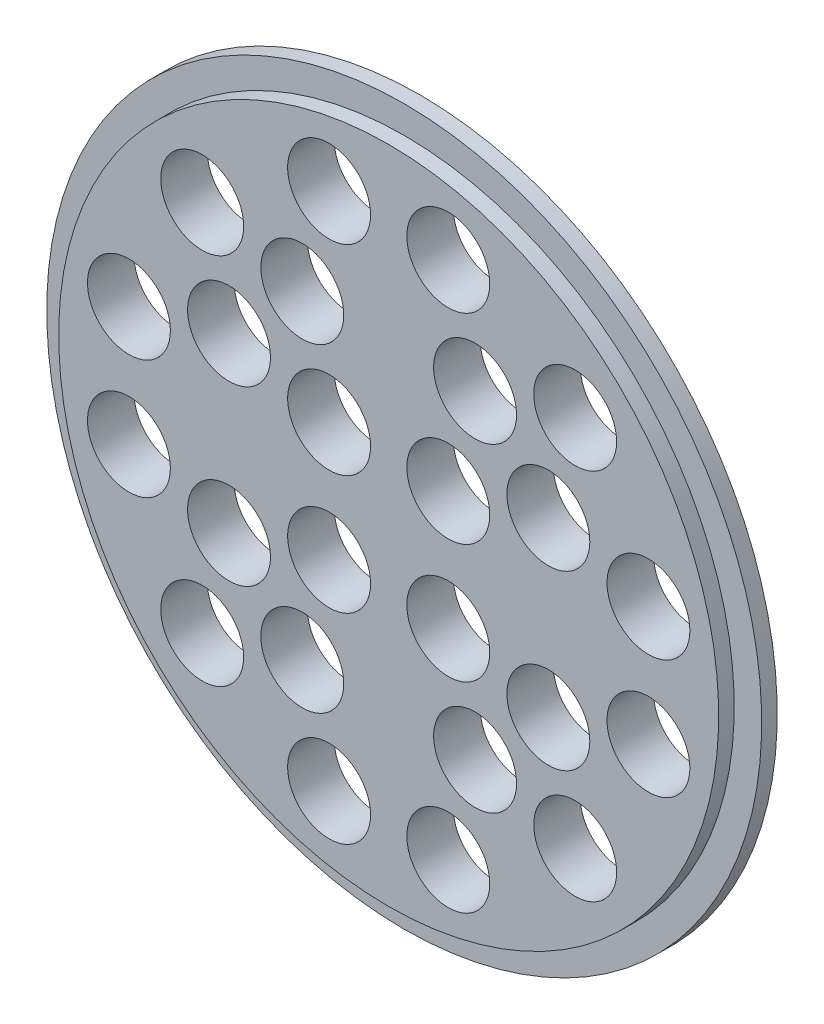
ISO-10303-21;
HEADER;
FILE_DESCRIPTION(('STEP AP214'),'2;1');
FILE_NAME('part.step','',(''),(''),'','','');
FILE_SCHEMA(('AUTOMOTIVE_DESIGN { 1 0 10303 214 1 1 1 1 }'));
ENDSEC;
DATA;
#1=APPLICATION_CONTEXT('core data for automotive mechanical design processes');
#2=APPLICATION_PROTOCOL_DEFINITION('international standard','automotive_design',2000,#1);
#3=PRODUCT_CONTEXT('',#1,'mechanical');
#4=PRODUCT('Part','Part','',(#3));
#5=PRODUCT_RELATED_PRODUCT_CATEGORY('part','',(#4));
#6=PRODUCT_DEFINITION_FORMATION('','',#4);
#7=PRODUCT_DEFINITION_CONTEXT('part definition',#1,'design');
#8=PRODUCT_DEFINITION('design','',#6,#7);
#9=PRODUCT_DEFINITION_SHAPE('','',#8);
#10=(LENGTH_UNIT() NAMED_UNIT(*) SI_UNIT(.MILLI.,.METRE.));
#11=(NAMED_UNIT(*) PLANE_ANGLE_UNIT() SI_UNIT($,.RADIAN.));
#12=(NAMED_UNIT(*) SI_UNIT($,.STERADIAN.) SOLID_ANGLE_UNIT());
#13=UNCERTAINTY_MEASURE_WITH_UNIT(LENGTH_MEASURE(1.E-05),#10,'distance_accuracy_value','');
#14=(GEOMETRIC_REPRESENTATION_CONTEXT(3) GLOBAL_UNCERTAINTY_ASSIGNED_CONTEXT((#13)) GLOBAL_UNIT_ASSIGNED_CONTEXT((#10,
#11,#12)) REPRESENTATION_CONTEXT('',''));
#15=CARTESIAN_POINT('',(0.,0.,0.));
#16=DIRECTION('',(0.,0.,1.));
#17=DIRECTION('',(1.,0.,0.));
#18=AXIS2_PLACEMENT_3D('',#15,#16,#17);
#19=CARTESIAN_POINT('',(0.,0.,0.));
#20=DIRECTION('',(0.,0.,1.));
#21=DIRECTION('',(1.,0.,0.));
#22=AXIS2_PLACEMENT_3D('',#19,#20,#21);
#23=PLANE('',#22);
#24=CARTESIAN_POINT('',(-25.0684769508544,5.74996042511669,0.));
#25=DIRECTION('',(0.,0.,1.));
#26=DIRECTION('',(1.,0.,0.));
#27=AXIS2_PLACEMENT_3D('',#24,#25,#26);
#28=CIRCLE('',#27,3.99999999999999);
#29=CARTESIAN_POINT('',(-21.0684769508544,5.74996042511669,0.));
#30=VERTEX_POINT('',#29);
#31=EDGE_CURVE('E104',#30,#30,#28,.T.);
#32=ORIENTED_EDGE('',*,*,#31,.T.);
#33=EDGE_LOOP('',(#32));
#34=FACE_BOUND('',#33,.T.);
#35=CARTESIAN_POINT('',(-5.74996042504571,25.0684769508707,0.));
#36=DIRECTION('',(0.,0.,1.));
#37=DIRECTION('',(1.,0.,0.));
#38=AXIS2_PLACEMENT_3D('',#35,#36,#37);
#39=CIRCLE('',#38,4.00000000000001);
#40=CARTESIAN_POINT('',(-1.7499604250457,25.0684769508707,0.));
#41=VERTEX_POINT('',#40);
#42=EDGE_CURVE('E118',#41,#41,#39,.T.);
#43=ORIENTED_EDGE('',*,*,#42,.T.);
#44=EDGE_LOOP('',(#43));
#45=FACE_BOUND('',#44,.T.);
#46=CARTESIAN_POINT('',(-8.33815087608457,15.4092186879837,0.));
#47=DIRECTION('',(0.,0.,1.));
#48=DIRECTION('',(1.,0.,0.));
#49=AXIS2_PLACEMENT_3D('',#46,#47,#48);
#50=CIRCLE('',#49,4.);
#51=CARTESIAN_POINT('',(-4.33815087608457,15.4092186879837,0.));
#52=VERTEX_POINT('',#51);
#53=EDGE_CURVE('E124',#52,#52,#50,.T.);
#54=ORIENTED_EDGE('',*,*,#53,.T.);
#55=EDGE_LOOP('',(#54));
#56=FACE_BOUND('',#55,.T.);
#57=CARTESIAN_POINT('',(-17.9974091389716,17.9974091390226,0.));
#58=DIRECTION('',(0.,0.,1.));
#59=DIRECTION('',(1.,0.,0.));
#60=AXIS2_PLACEMENT_3D('',#57,#58,#59);
#61=CIRCLE('',#60,4.);
#62=CARTESIAN_POINT('',(-13.9974091389716,17.9974091390226,0.));
#63=VERTEX_POINT('',#62);
#64=EDGE_CURVE('E130',#63,#63,#61,.T.);
#65=ORIENTED_EDGE('',*,*,#64,.T.);
#66=EDGE_LOOP('',(#65));
#67=FACE_BOUND('',#66,.T.);
#68=CARTESIAN_POINT('',(-15.4092186879601,8.33815087612825,0.));
#69=DIRECTION('',(0.,0.,1.));
#70=DIRECTION('',(1.,0.,0.));
#71=AXIS2_PLACEMENT_3D('',#68,#69,#70);
#72=CIRCLE('',#71,4.);
#73=CARTESIAN_POINT('',(-11.4092186879601,8.33815087612825,0.));
#74=VERTEX_POINT('',#73);
#75=EDGE_CURVE('E136',#74,#74,#72,.T.);
#76=ORIENTED_EDGE('',*,*,#75,.T.);
#77=EDGE_LOOP('',(#76));
#78=FACE_BOUND('',#77,.T.);
#79=CARTESIAN_POINT('',(-5.74996042507306,5.74996042508934,0.));
#80=DIRECTION('',(0.,0.,1.));
#81=DIRECTION('',(1.,0.,0.));
#82=AXIS2_PLACEMENT_3D('',#79,#80,#81);
#83=CIRCLE('',#82,4.);
#84=CARTESIAN_POINT('',(-1.74996042507306,5.74996042508934,0.));
#85=VERTEX_POINT('',#84);
#86=EDGE_CURVE('E142',#85,#85,#83,.T.);
#87=ORIENTED_EDGE('',*,*,#86,.T.);
#88=EDGE_LOOP('',(#87));
#89=FACE_BOUND('',#88,.T.);
#90=CARTESIAN_POINT('',(-5.74992085018606,-25.0685165257759,0.));
#91=DIRECTION('',(0.,0.,1.));
#92=DIRECTION('',(1.,0.,0.));
#93=AXIS2_PLACEMENT_3D('',#90,#91,#92);
#94=CIRCLE('',#93,4.00000000000001);
#95=CARTESIAN_POINT('',(-1.74992085018605,-25.0685165257759,0.));
#96=VERTEX_POINT('',#95);
#97=EDGE_CURVE('E148',#96,#96,#94,.T.);
#98=ORIENTED_EDGE('',*,*,#97,.T.);
#99=EDGE_LOOP('',(#98));
#100=FACE_BOUND('',#99,.T.);
#101=CARTESIAN_POINT('',(-25.0684373759492,-5.74999999997634,0.));
#102=DIRECTION('',(0.,0.,1.));
#103=DIRECTION('',(1.,0.,0.));
#104=AXIS2_PLACEMENT_3D('',#101,#102,#103);
#105=CIRCLE('',#104,3.99999999999999);
#106=CARTESIAN_POINT('',(-21.0684373759492,-5.74999999997634,0.));
#107=VERTEX_POINT('',#106);
#108=EDGE_CURVE('E154',#107,#107,#105,.T.);
#109=ORIENTED_EDGE('',*,*,#108,.T.);
#110=EDGE_LOOP('',(#109));
#111=FACE_BOUND('',#110,.T.);
#112=CARTESIAN_POINT('',(-15.409179113061,-8.33819045101064,0.));
#113=DIRECTION('',(0.,0.,1.));
#114=DIRECTION('',(1.,0.,0.));
#115=AXIS2_PLACEMENT_3D('',#112,#113,#114);
#116=CIRCLE('',#115,3.99999999999999);
#117=CARTESIAN_POINT('',(-11.409179113061,-8.33819045101064,0.));
#118=VERTEX_POINT('',#117);
#119=EDGE_CURVE('E160',#118,#118,#116,.T.);
#120=ORIENTED_EDGE('',*,*,#119,.T.);
#121=EDGE_LOOP('',(#120));
#122=FACE_BOUND('',#121,.T.);
#123=CARTESIAN_POINT('',(-17.9973695640953,-17.9974487138989,0.));
#124=DIRECTION('',(0.,0.,1.));
#125=DIRECTION('',(1.,0.,0.));
#126=AXIS2_PLACEMENT_3D('',#123,#124,#125);
#127=CIRCLE('',#126,4.);
#128=CARTESIAN_POINT('',(-13.9973695640953,-17.9974487138989,0.));
#129=VERTEX_POINT('',#128);
#130=EDGE_CURVE('E166',#129,#129,#127,.T.);
#131=ORIENTED_EDGE('',*,*,#130,.T.);
#132=EDGE_LOOP('',(#131));
#133=FACE_BOUND('',#132,.T.);
#134=CARTESIAN_POINT('',(-8.33811130120218,-15.4092582628828,0.));
#135=DIRECTION('',(0.,0.,1.));
#136=DIRECTION('',(1.,0.,0.));
#137=AXIS2_PLACEMENT_3D('',#134,#135,#136);
#138=CIRCLE('',#137,4.);
#139=CARTESIAN_POINT('',(-4.33811130120218,-15.4092582628828,0.));
#140=VERTEX_POINT('',#139);
#141=EDGE_CURVE('E172',#140,#140,#138,.T.);
#142=ORIENTED_EDGE('',*,*,#141,.T.);
#143=EDGE_LOOP('',(#142));
#144=FACE_BOUND('',#143,.T.);
#145=CARTESIAN_POINT('',(-5.74992085016783,-5.74999999999457,0.));
#146=DIRECTION('',(0.,0.,1.));
#147=DIRECTION('',(1.,0.,0.));
#148=AXIS2_PLACEMENT_3D('',#145,#146,#147);
#149=CIRCLE('',#148,4.);
#150=CARTESIAN_POINT('',(-1.74992085016782,-5.74999999999457,0.));
#151=VERTEX_POINT('',#150);
#152=EDGE_CURVE('E178',#151,#151,#149,.T.);
#153=ORIENTED_EDGE('',*,*,#152,.T.);
#154=EDGE_LOOP('',(#153));
#155=FACE_BOUND('',#154,.T.);
#156=CARTESIAN_POINT('',(0.,0.,0.));
#157=DIRECTION('',(0.,0.,-1.));
#158=DIRECTION('',(0.,1.,0.));
#159=AXIS2_PLACEMENT_3D('',#156,#157,#158);
#160=CIRCLE('',#159,31.85);
#161=CARTESIAN_POINT('',(-0.774999999999998,-31.8405696400049,0.));
#162=VERTEX_POINT('',#161);
#163=CARTESIAN_POINT('',(-0.774999999999998,31.8405696400049,0.));
#164=VERTEX_POINT('',#163);
#165=EDGE_CURVE('E94',#162,#164,#160,.T.);
#166=ORIENTED_EDGE('',*,*,#165,.T.);
#167=DIRECTION('',(0.,1.,0.));
#168=VECTOR('',#167,1.);
#169=CARTESIAN_POINT('',(-0.774999999999998,-34.5,0.));
#170=LINE('',#169,#168);
#171=EDGE_CURVE('E58',#162,#164,#170,.T.);
#172=ORIENTED_EDGE('',*,*,#171,.F.);
#173=EDGE_LOOP('',(#166,#172));
#174=FACE_BOUND('',#173,.T.);
#175=ADVANCED_FACE('F36',(#34,#45,#56,#67,#78,#89,#100,#111,#122,#133,#144,#155,#174),#23,.F.);
#176=CARTESIAN_POINT('',(0.,0.,0.));
#177=DIRECTION('',(0.,0.,-1.));
#178=DIRECTION('',(0.,1.,0.));
#179=AXIS2_PLACEMENT_3D('',#176,#177,#178);
#180=CYLINDRICAL_SURFACE('',#179,31.85);
#181=CARTESIAN_POINT('',(0.,0.,1.49999999999999));
#182=DIRECTION('',(0.,0.,-1.));
#183=DIRECTION('',(0.,1.,0.));
#184=AXIS2_PLACEMENT_3D('',#181,#182,#183);
#185=CIRCLE('',#184,31.85);
#186=CARTESIAN_POINT('',(-0.775,-31.8405696400049,1.49999999999999));
#187=VERTEX_POINT('',#186);
#188=CARTESIAN_POINT('',(-0.775,31.8405696400049,1.49999999999999));
#189=VERTEX_POINT('',#188);
#190=EDGE_CURVE('E95',#187,#189,#185,.T.);
#191=ORIENTED_EDGE('',*,*,#190,.T.);
#192=DIRECTION('',(0.,0.,-1.));
#193=VECTOR('',#192,1.);
#194=CARTESIAN_POINT('',(-0.774999999999998,31.8405696400049,0.));
#195=LINE('',#194,#193);
#196=EDGE_CURVE('E109',#189,#164,#195,.T.);
#197=ORIENTED_EDGE('',*,*,#196,.T.);
#198=ORIENTED_EDGE('',*,*,#165,.F.);
#199=DIRECTION('',(0.,0.,-1.));
#200=VECTOR('',#199,1.);
#201=CARTESIAN_POINT('',(-0.774999999999998,-31.8405696400049,0.));
#202=LINE('',#201,#200);
#203=EDGE_CURVE('E298',#162,#187,#202,.F.);
#204=ORIENTED_EDGE('',*,*,#203,.T.);
#205=EDGE_LOOP('',(#191,#197,#198,#204));
#206=FACE_BOUND('',#205,.T.);
#207=ADVANCED_FACE('F272',(#206),#180,.T.);
#208=CARTESIAN_POINT('',(0.,0.,4.5));
#209=DIRECTION('',(0.,0.,1.));
#210=DIRECTION('',(1.,0.,0.));
#211=AXIS2_PLACEMENT_3D('',#208,#209,#210);
#212=PLANE('',#211);
#213=CARTESIAN_POINT('',(0.,0.,4.49999999999999));
#214=DIRECTION('',(0.,0.,-1.));
#215=DIRECTION('',(0.,1.,0.));
#216=AXIS2_PLACEMENT_3D('',#213,#214,#215);
#217=CIRCLE('',#216,31.85);
#218=CARTESIAN_POINT('',(0.,31.85,4.5));
#219=VERTEX_POINT('',#218);
#220=EDGE_CURVE('E112',#219,#219,#217,.T.);
#221=ORIENTED_EDGE('',*,*,#220,.F.);
#222=EDGE_LOOP('',(#221));
#223=FACE_BOUND('',#222,.T.);
#224=CARTESIAN_POINT('',(-5.74996042504571,25.0684769508707,4.5));
#225=DIRECTION('',(0.,0.,1.));
#226=DIRECTION('',(1.,0.,0.));
#227=AXIS2_PLACEMENT_3D('',#224,#225,#226);
#228=CIRCLE('',#227,4.00000000000001);
#229=CARTESIAN_POINT('',(-1.7499604250457,25.0684769508707,4.5));
#230=VERTEX_POINT('',#229);
#231=EDGE_CURVE('E121',#230,#230,#228,.T.);
#232=ORIENTED_EDGE('',*,*,#231,.F.);
#233=EDGE_LOOP('',(#232));
#234=FACE_BOUND('',#233,.T.);
#235=CARTESIAN_POINT('',(-17.9974091389716,17.9974091390226,4.5));
#236=DIRECTION('',(0.,0.,1.));
#237=DIRECTION('',(1.,0.,0.));
#238=AXIS2_PLACEMENT_3D('',#235,#236,#237);
#239=CIRCLE('',#238,4.);
#240=CARTESIAN_POINT('',(-13.9974091389716,17.9974091390226,4.5));
#241=VERTEX_POINT('',#240);
#242=EDGE_CURVE('E133',#241,#241,#239,.T.);
#243=ORIENTED_EDGE('',*,*,#242,.F.);
#244=EDGE_LOOP('',(#243));
#245=FACE_BOUND('',#244,.T.);
#246=CARTESIAN_POINT('',(-5.74996042507306,5.74996042508934,4.5));
#247=DIRECTION('',(0.,0.,1.));
#248=DIRECTION('',(1.,0.,0.));
#249=AXIS2_PLACEMENT_3D('',#246,#247,#248);
#250=CIRCLE('',#249,4.);
#251=CARTESIAN_POINT('',(-1.74996042507306,5.74996042508934,4.5));
#252=VERTEX_POINT('',#251);
#253=EDGE_CURVE('E145',#252,#252,#250,.T.);
#254=ORIENTED_EDGE('',*,*,#253,.F.);
#255=EDGE_LOOP('',(#254));
#256=FACE_BOUND('',#255,.T.);
#257=CARTESIAN_POINT('',(-25.0684373759492,-5.74999999997634,4.5));
#258=DIRECTION('',(0.,0.,1.));
#259=DIRECTION('',(1.,0.,0.));
#260=AXIS2_PLACEMENT_3D('',#257,#258,#259);
#261=CIRCLE('',#260,3.99999999999999);
#262=CARTESIAN_POINT('',(-21.0684373759492,-5.74999999997634,4.5));
#263=VERTEX_POINT('',#262);
#264=EDGE_CURVE('E157',#263,#263,#261,.T.);
#265=ORIENTED_EDGE('',*,*,#264,.F.);
#266=EDGE_LOOP('',(#265));
#267=FACE_BOUND('',#266,.T.);
#268=CARTESIAN_POINT('',(-17.9973695640953,-17.9974487138989,4.5));
#269=DIRECTION('',(0.,0.,1.));
#270=DIRECTION('',(1.,0.,0.));
#271=AXIS2_PLACEMENT_3D('',#268,#269,#270);
#272=CIRCLE('',#271,4.);
#273=CARTESIAN_POINT('',(-13.9973695640953,-17.9974487138989,4.5));
#274=VERTEX_POINT('',#273);
#275=EDGE_CURVE('E169',#274,#274,#272,.T.);
#276=ORIENTED_EDGE('',*,*,#275,.F.);
#277=EDGE_LOOP('',(#276));
#278=FACE_BOUND('',#277,.T.);
#279=CARTESIAN_POINT('',(-5.74992085016783,-5.74999999999457,4.5));
#280=DIRECTION('',(0.,0.,1.));
#281=DIRECTION('',(1.,0.,0.));
#282=AXIS2_PLACEMENT_3D('',#279,#280,#281);
#283=CIRCLE('',#282,4.);
#284=CARTESIAN_POINT('',(-1.74992085016782,-5.74999999999457,4.5));
#285=VERTEX_POINT('',#284);
#286=EDGE_CURVE('E181',#285,#285,#283,.T.);
#287=ORIENTED_EDGE('',*,*,#286,.F.);
#288=EDGE_LOOP('',(#287));
#289=FACE_BOUND('',#288,.T.);
#290=CARTESIAN_POINT('',(5.75003957490697,-25.0684769508653,4.5));
#291=DIRECTION('',(0.,0.,1.));
#292=DIRECTION('',(1.,0.,0.));
#293=AXIS2_PLACEMENT_3D('',#290,#291,#292);
#294=CIRCLE('',#293,4.00000000000001);
#295=CARTESIAN_POINT('',(9.75003957490698,-25.0684769508653,4.5));
#296=VERTEX_POINT('',#295);
#297=EDGE_CURVE('E193',#296,#296,#294,.T.);
#298=ORIENTED_EDGE('',*,*,#297,.F.);
#299=EDGE_LOOP('',(#298));
#300=FACE_BOUND('',#299,.T.);
#301=CARTESIAN_POINT('',(17.9974882888262,-17.9974091390056,4.5));
#302=DIRECTION('',(0.,0.,1.));
#303=DIRECTION('',(1.,0.,0.));
#304=AXIS2_PLACEMENT_3D('',#301,#302,#303);
#305=CIRCLE('',#304,3.99999999999999);
#306=CARTESIAN_POINT('',(21.9974882888262,-17.9974091390056,4.5));
#307=VERTEX_POINT('',#306);
#308=EDGE_CURVE('E205',#307,#307,#305,.T.);
#309=ORIENTED_EDGE('',*,*,#308,.F.);
#310=EDGE_LOOP('',(#309));
#311=FACE_BOUND('',#310,.T.);
#312=CARTESIAN_POINT('',(5.75003957491609,-5.74996042508391,4.5));
#313=DIRECTION('',(0.,0.,1.));
#314=DIRECTION('',(1.,0.,0.));
#315=AXIS2_PLACEMENT_3D('',#312,#313,#314);
#316=CIRCLE('',#315,4.);
#317=CARTESIAN_POINT('',(9.75003957491608,-5.74996042508391,4.5));
#318=VERTEX_POINT('',#317);
#319=EDGE_CURVE('E217',#318,#318,#316,.T.);
#320=ORIENTED_EDGE('',*,*,#319,.F.);
#321=EDGE_LOOP('',(#320));
#322=FACE_BOUND('',#321,.T.);
#323=CARTESIAN_POINT('',(25.0685165257814,5.75,4.5));
#324=DIRECTION('',(0.,0.,1.));
#325=DIRECTION('',(1.,0.,0.));
#326=AXIS2_PLACEMENT_3D('',#323,#324,#325);
#327=CIRCLE('',#326,4.00000000000003);
#328=CARTESIAN_POINT('',(29.0685165257814,5.75,4.5));
#329=VERTEX_POINT('',#328);
#330=EDGE_CURVE('E229',#329,#329,#327,.T.);
#331=ORIENTED_EDGE('',*,*,#330,.F.);
#332=EDGE_LOOP('',(#331));
#333=FACE_BOUND('',#332,.T.);
#334=CARTESIAN_POINT('',(17.9974487139159,17.9974487139159,4.5));
#335=DIRECTION('',(0.,0.,1.));
#336=DIRECTION('',(1.,0.,0.));
#337=AXIS2_PLACEMENT_3D('',#334,#335,#336);
#338=CIRCLE('',#337,3.99999999999999);
#339=CARTESIAN_POINT('',(21.9974487139159,17.9974487139159,4.5));
#340=VERTEX_POINT('',#339);
#341=EDGE_CURVE('E241',#340,#340,#338,.T.);
#342=ORIENTED_EDGE('',*,*,#341,.F.);
#343=EDGE_LOOP('',(#342));
#344=FACE_BOUND('',#343,.T.);
#345=CARTESIAN_POINT('',(5.75,5.75,4.5));
#346=DIRECTION('',(0.,0.,1.));
#347=DIRECTION('',(1.,0.,0.));
#348=AXIS2_PLACEMENT_3D('',#345,#346,#347);
#349=CIRCLE('',#348,4.);
#350=CARTESIAN_POINT('',(9.75,5.75,4.5));
#351=VERTEX_POINT('',#350);
#352=EDGE_CURVE('E11',#351,#351,#349,.T.);
#353=ORIENTED_EDGE('',*,*,#352,.F.);
#354=EDGE_LOOP('',(#353));
#355=FACE_BOUND('',#354,.T.);
#356=CARTESIAN_POINT('',(8.33819045102524,15.4092582628907,4.5));
#357=DIRECTION('',(0.,0.,1.));
#358=DIRECTION('',(1.,0.,0.));
#359=AXIS2_PLACEMENT_3D('',#356,#357,#358);
#360=CIRCLE('',#359,4.00000000000001);
#361=CARTESIAN_POINT('',(12.3381904510253,15.4092582628907,4.5));
#362=VERTEX_POINT('',#361);
#363=EDGE_CURVE('E247',#362,#362,#360,.T.);
#364=ORIENTED_EDGE('',*,*,#363,.F.);
#365=EDGE_LOOP('',(#364));
#366=FACE_BOUND('',#365,.T.);
#367=CARTESIAN_POINT('',(15.4092582628907,8.33819045102518,4.5));
#368=DIRECTION('',(0.,0.,1.));
#369=DIRECTION('',(1.,0.,0.));
#370=AXIS2_PLACEMENT_3D('',#367,#368,#369);
#371=CIRCLE('',#370,3.99999999999999);
#372=CARTESIAN_POINT('',(19.4092582628907,8.33819045102518,4.5));
#373=VERTEX_POINT('',#372);
#374=EDGE_CURVE('E235',#373,#373,#371,.T.);
#375=ORIENTED_EDGE('',*,*,#374,.F.);
#376=EDGE_LOOP('',(#375));
#377=FACE_BOUND('',#376,.T.);
#378=CARTESIAN_POINT('',(5.75,25.0685165257814,4.5));
#379=DIRECTION('',(0.,0.,1.));
#380=DIRECTION('',(1.,0.,0.));
#381=AXIS2_PLACEMENT_3D('',#378,#379,#380);
#382=CIRCLE('',#381,4.00000000000001);
#383=CARTESIAN_POINT('',(9.75000000000001,25.0685165257814,4.5));
#384=VERTEX_POINT('',#383);
#385=EDGE_CURVE('E223',#384,#384,#382,.T.);
#386=ORIENTED_EDGE('',*,*,#385,.F.);
#387=EDGE_LOOP('',(#386));
#388=FACE_BOUND('',#387,.T.);
#389=CARTESIAN_POINT('',(15.4092978378055,-8.3381508761137,4.5));
#390=DIRECTION('',(0.,0.,1.));
#391=DIRECTION('',(1.,0.,0.));
#392=AXIS2_PLACEMENT_3D('',#389,#390,#391);
#393=CIRCLE('',#392,3.99999999999999);
#394=CARTESIAN_POINT('',(19.4092978378055,-8.3381508761137,4.5));
#395=VERTEX_POINT('',#394);
#396=EDGE_CURVE('E211',#395,#395,#393,.T.);
#397=ORIENTED_EDGE('',*,*,#396,.F.);
#398=EDGE_LOOP('',(#397));
#399=FACE_BOUND('',#398,.T.);
#400=CARTESIAN_POINT('',(8.33823002593671,-15.4092186879758,4.5));
#401=DIRECTION('',(0.,0.,1.));
#402=DIRECTION('',(1.,0.,0.));
#403=AXIS2_PLACEMENT_3D('',#400,#401,#402);
#404=CIRCLE('',#403,4.);
#405=CARTESIAN_POINT('',(12.3382300259367,-15.4092186879758,4.5));
#406=VERTEX_POINT('',#405);
#407=EDGE_CURVE('E199',#406,#406,#404,.T.);
#408=ORIENTED_EDGE('',*,*,#407,.F.);
#409=EDGE_LOOP('',(#408));
#410=FACE_BOUND('',#409,.T.);
#411=CARTESIAN_POINT('',(25.0685561006974,-5.74996042509303,4.5));
#412=DIRECTION('',(0.,0.,1.));
#413=DIRECTION('',(1.,0.,0.));
#414=AXIS2_PLACEMENT_3D('',#411,#412,#413);
#415=CIRCLE('',#414,4.00000000000002);
#416=CARTESIAN_POINT('',(29.0685561006975,-5.74996042509303,4.5));
#417=VERTEX_POINT('',#416);
#418=EDGE_CURVE('E187',#417,#417,#415,.T.);
#419=ORIENTED_EDGE('',*,*,#418,.F.);
#420=EDGE_LOOP('',(#419));
#421=FACE_BOUND('',#420,.T.);
#422=CARTESIAN_POINT('',(-8.33811130120218,-15.4092582628828,4.5));
#423=DIRECTION('',(0.,0.,1.));
#424=DIRECTION('',(1.,0.,0.));
#425=AXIS2_PLACEMENT_3D('',#422,#423,#424);
#426=CIRCLE('',#425,4.);
#427=CARTESIAN_POINT('',(-4.33811130120218,-15.4092582628828,4.5));
#428=VERTEX_POINT('',#427);
#429=EDGE_CURVE('E175',#428,#428,#426,.T.);
#430=ORIENTED_EDGE('',*,*,#429,.F.);
#431=EDGE_LOOP('',(#430));
#432=FACE_BOUND('',#431,.T.);
#433=CARTESIAN_POINT('',(-15.409179113061,-8.33819045101064,4.5));
#434=DIRECTION('',(0.,0.,1.));
#435=DIRECTION('',(1.,0.,0.));
#436=AXIS2_PLACEMENT_3D('',#433,#434,#435);
#437=CIRCLE('',#436,3.99999999999999);
#438=CARTESIAN_POINT('',(-11.409179113061,-8.33819045101064,4.5));
#439=VERTEX_POINT('',#438);
#440=EDGE_CURVE('E163',#439,#439,#437,.T.);
#441=ORIENTED_EDGE('',*,*,#440,.F.);
#442=EDGE_LOOP('',(#441));
#443=FACE_BOUND('',#442,.T.);
#444=CARTESIAN_POINT('',(-5.74992085018606,-25.0685165257759,4.5));
#445=DIRECTION('',(0.,0.,1.));
#446=DIRECTION('',(1.,0.,0.));
#447=AXIS2_PLACEMENT_3D('',#444,#445,#446);
#448=CIRCLE('',#447,4.00000000000001);
#449=CARTESIAN_POINT('',(-1.74992085018605,-25.0685165257759,4.5));
#450=VERTEX_POINT('',#449);
#451=EDGE_CURVE('E151',#450,#450,#448,.T.);
#452=ORIENTED_EDGE('',*,*,#451,.F.);
#453=EDGE_LOOP('',(#452));
#454=FACE_BOUND('',#453,.T.);
#455=CARTESIAN_POINT('',(-15.4092186879601,8.33815087612825,4.5));
#456=DIRECTION('',(0.,0.,1.));
#457=DIRECTION('',(1.,0.,0.));
#458=AXIS2_PLACEMENT_3D('',#455,#456,#457);
#459=CIRCLE('',#458,4.);
#460=CARTESIAN_POINT('',(-11.4092186879601,8.33815087612825,4.5));
#461=VERTEX_POINT('',#460);
#462=EDGE_CURVE('E139',#461,#461,#459,.T.);
#463=ORIENTED_EDGE('',*,*,#462,.F.);
#464=EDGE_LOOP('',(#463));
#465=FACE_BOUND('',#464,.T.);
#466=CARTESIAN_POINT('',(-8.33815087608457,15.4092186879837,4.5));
#467=DIRECTION('',(0.,0.,1.));
#468=DIRECTION('',(1.,0.,0.));
#469=AXIS2_PLACEMENT_3D('',#466,#467,#468);
#470=CIRCLE('',#469,4.);
#471=CARTESIAN_POINT('',(-4.33815087608457,15.4092186879837,4.5));
#472=VERTEX_POINT('',#471);
#473=EDGE_CURVE('E127',#472,#472,#470,.T.);
#474=ORIENTED_EDGE('',*,*,#473,.F.);
#475=EDGE_LOOP('',(#474));
#476=FACE_BOUND('',#475,.T.);
#477=CARTESIAN_POINT('',(-25.0684769508544,5.74996042511669,4.5));
#478=DIRECTION('',(0.,0.,1.));
#479=DIRECTION('',(1.,0.,0.));
#480=AXIS2_PLACEMENT_3D('',#477,#478,#479);
#481=CIRCLE('',#480,3.99999999999999);
#482=CARTESIAN_POINT('',(-21.0684769508544,5.74996042511669,4.5));
#483=VERTEX_POINT('',#482);
#484=EDGE_CURVE('E115',#483,#483,#481,.T.);
#485=ORIENTED_EDGE('',*,*,#484,.F.);
#486=EDGE_LOOP('',(#485));
#487=FACE_BOUND('',#486,.T.);
#488=ADVANCED_FACE('F277',(#223,#234,#245,#256,#267,#278,#289,#300,#311,#322,#333,#344,#355,
#366,#377,#388,#399,#410,#421,#432,#443,#454,#465,#476,#487),#212,.T.);
#489=CARTESIAN_POINT('',(0.775,31.8405696400049,0.));
#490=VERTEX_POINT('',#489);
#491=CARTESIAN_POINT('',(0.775,-31.8405696400049,0.));
#492=VERTEX_POINT('',#491);
#493=EDGE_CURVE('E90',#490,#492,#160,.T.);
#494=ORIENTED_EDGE('',*,*,#493,.T.);
#495=DIRECTION('',(0.,1.,0.));
#496=VECTOR('',#495,1.);
#497=CARTESIAN_POINT('',(0.775,-34.5,0.));
#498=LINE('',#497,#496);
#499=EDGE_CURVE('E82',#492,#490,#498,.T.);
#500=ORIENTED_EDGE('',*,*,#499,.T.);
#501=EDGE_LOOP('',(#494,#500));
#502=FACE_BOUND('',#501,.T.);
#503=CARTESIAN_POINT('',(5.75,5.75,0.));
#504=DIRECTION('',(0.,0.,1.));
#505=DIRECTION('',(1.,0.,0.));
#506=AXIS2_PLACEMENT_3D('',#503,#504,#505);
#507=CIRCLE('',#506,4.);
#508=CARTESIAN_POINT('',(9.75,5.75,0.));
#509=VERTEX_POINT('',#508);
#510=EDGE_CURVE('E40',#509,#509,#507,.T.);
#511=ORIENTED_EDGE('',*,*,#510,.T.);
#512=EDGE_LOOP('',(#511));
#513=FACE_BOUND('',#512,.T.);
#514=CARTESIAN_POINT('',(8.33819045102524,15.4092582628907,0.));
#515=DIRECTION('',(0.,0.,1.));
#516=DIRECTION('',(1.,0.,0.));
#517=AXIS2_PLACEMENT_3D('',#514,#515,#516);
#518=CIRCLE('',#517,4.00000000000001);
#519=CARTESIAN_POINT('',(12.3381904510253,15.4092582628907,0.));
#520=VERTEX_POINT('',#519);
#521=EDGE_CURVE('E244',#520,#520,#518,.T.);
#522=ORIENTED_EDGE('',*,*,#521,.T.);
#523=EDGE_LOOP('',(#522));
#524=FACE_BOUND('',#523,.T.);
#525=CARTESIAN_POINT('',(17.9974487139159,17.9974487139159,0.));
#526=DIRECTION('',(0.,0.,1.));
#527=DIRECTION('',(1.,0.,0.));
#528=AXIS2_PLACEMENT_3D('',#525,#526,#527);
#529=CIRCLE('',#528,3.99999999999999);
#530=CARTESIAN_POINT('',(21.9974487139159,17.9974487139159,0.));
#531=VERTEX_POINT('',#530);
#532=EDGE_CURVE('E238',#531,#531,#529,.T.);
#533=ORIENTED_EDGE('',*,*,#532,.T.);
#534=EDGE_LOOP('',(#533));
#535=FACE_BOUND('',#534,.T.);
#536=CARTESIAN_POINT('',(15.4092582628907,8.33819045102518,0.));
#537=DIRECTION('',(0.,0.,1.));
#538=DIRECTION('',(1.,0.,0.));
#539=AXIS2_PLACEMENT_3D('',#536,#537,#538);
#540=CIRCLE('',#539,3.99999999999999);
#541=CARTESIAN_POINT('',(19.4092582628907,8.33819045102518,0.));
#542=VERTEX_POINT('',#541);
#543=EDGE_CURVE('E232',#542,#542,#540,.T.);
#544=ORIENTED_EDGE('',*,*,#543,.T.);
#545=EDGE_LOOP('',(#544));
#546=FACE_BOUND('',#545,.T.);
#547=CARTESIAN_POINT('',(25.0685165257814,5.75,0.));
#548=DIRECTION('',(0.,0.,1.));
#549=DIRECTION('',(1.,0.,0.));
#550=AXIS2_PLACEMENT_3D('',#547,#548,#549);
#551=CIRCLE('',#550,4.00000000000003);
#552=CARTESIAN_POINT('',(29.0685165257814,5.75,0.));
#553=VERTEX_POINT('',#552);
#554=EDGE_CURVE('E226',#553,#553,#551,.T.);
#555=ORIENTED_EDGE('',*,*,#554,.T.);
#556=EDGE_LOOP('',(#555));
#557=FACE_BOUND('',#556,.T.);
#558=CARTESIAN_POINT('',(5.75,25.0685165257814,0.));
#559=DIRECTION('',(0.,0.,1.));
#560=DIRECTION('',(1.,0.,0.));
#561=AXIS2_PLACEMENT_3D('',#558,#559,#560);
#562=CIRCLE('',#561,4.00000000000001);
#563=CARTESIAN_POINT('',(9.75000000000001,25.0685165257814,0.));
#564=VERTEX_POINT('',#563);
#565=EDGE_CURVE('E220',#564,#564,#562,.T.);
#566=ORIENTED_EDGE('',*,*,#565,.T.);
#567=EDGE_LOOP('',(#566));
#568=FACE_BOUND('',#567,.T.);
#569=CARTESIAN_POINT('',(5.75003957491609,-5.74996042508391,0.));
#570=DIRECTION('',(0.,0.,1.));
#571=DIRECTION('',(1.,0.,0.));
#572=AXIS2_PLACEMENT_3D('',#569,#570,#571);
#573=CIRCLE('',#572,4.);
#574=CARTESIAN_POINT('',(9.75003957491608,-5.74996042508391,0.));
#575=VERTEX_POINT('',#574);
#576=EDGE_CURVE('E214',#575,#575,#573,.T.);
#577=ORIENTED_EDGE('',*,*,#576,.T.);
#578=EDGE_LOOP('',(#577));
#579=FACE_BOUND('',#578,.T.);
#580=CARTESIAN_POINT('',(15.4092978378055,-8.3381508761137,0.));
#581=DIRECTION('',(0.,0.,1.));
#582=DIRECTION('',(1.,0.,0.));
#583=AXIS2_PLACEMENT_3D('',#580,#581,#582);
#584=CIRCLE('',#583,3.99999999999999);
#585=CARTESIAN_POINT('',(19.4092978378055,-8.3381508761137,0.));
#586=VERTEX_POINT('',#585);
#587=EDGE_CURVE('E208',#586,#586,#584,.T.);
#588=ORIENTED_EDGE('',*,*,#587,.T.);
#589=EDGE_LOOP('',(#588));
#590=FACE_BOUND('',#589,.T.);
#591=CARTESIAN_POINT('',(17.9974882888262,-17.9974091390056,0.));
#592=DIRECTION('',(0.,0.,1.));
#593=DIRECTION('',(1.,0.,0.));
#594=AXIS2_PLACEMENT_3D('',#591,#592,#593);
#595=CIRCLE('',#594,3.99999999999999);
#596=CARTESIAN_POINT('',(21.9974882888262,-17.9974091390056,0.));
#597=VERTEX_POINT('',#596);
#598=EDGE_CURVE('E202',#597,#597,#595,.T.);
#599=ORIENTED_EDGE('',*,*,#598,.T.);
#600=EDGE_LOOP('',(#599));
#601=FACE_BOUND('',#600,.T.);
#602=CARTESIAN_POINT('',(8.33823002593671,-15.4092186879758,0.));
#603=DIRECTION('',(0.,0.,1.));
#604=DIRECTION('',(1.,0.,0.));
#605=AXIS2_PLACEMENT_3D('',#602,#603,#604);
#606=CIRCLE('',#605,4.);
#607=CARTESIAN_POINT('',(12.3382300259367,-15.4092186879758,0.));
#608=VERTEX_POINT('',#607);
#609=EDGE_CURVE('E196',#608,#608,#606,.T.);
#610=ORIENTED_EDGE('',*,*,#609,.T.);
#611=EDGE_LOOP('',(#610));
#612=FACE_BOUND('',#611,.T.);
#613=CARTESIAN_POINT('',(5.75003957490697,-25.0684769508653,0.));
#614=DIRECTION('',(0.,0.,1.));
#615=DIRECTION('',(1.,0.,0.));
#616=AXIS2_PLACEMENT_3D('',#613,#614,#615);
#617=CIRCLE('',#616,4.00000000000001);
#618=CARTESIAN_POINT('',(9.75003957490698,-25.0684769508653,0.));
#619=VERTEX_POINT('',#618);
#620=EDGE_CURVE('E190',#619,#619,#617,.T.);
#621=ORIENTED_EDGE('',*,*,#620,.T.);
#622=EDGE_LOOP('',(#621));
#623=FACE_BOUND('',#622,.T.);
#624=CARTESIAN_POINT('',(25.0685561006974,-5.74996042509303,0.));
#625=DIRECTION('',(0.,0.,1.));
#626=DIRECTION('',(1.,0.,0.));
#627=AXIS2_PLACEMENT_3D('',#624,#625,#626);
#628=CIRCLE('',#627,4.00000000000002);
#629=CARTESIAN_POINT('',(29.0685561006975,-5.74996042509303,0.));
#630=VERTEX_POINT('',#629);
#631=EDGE_CURVE('E184',#630,#630,#628,.T.);
#632=ORIENTED_EDGE('',*,*,#631,.T.);
#633=EDGE_LOOP('',(#632));
#634=FACE_BOUND('',#633,.T.);
#635=ADVANCED_FACE('F253',(#502,#513,#524,#535,#546,#557,#568,#579,#590,#601,#612,#623,#634),
#23,.F.);
#636=CARTESIAN_POINT('',(5.75,5.75,4.5));
#637=DIRECTION('',(0.,0.,-1.));
#638=DIRECTION('',(-1.,0.,0.));
#639=AXIS2_PLACEMENT_3D('',#636,#637,#638);
#640=CYLINDRICAL_SURFACE('',#639,4.);
#641=ORIENTED_EDGE('',*,*,#352,.T.);
#642=EDGE_LOOP('',(#641));
#643=FACE_BOUND('',#642,.T.);
#644=ORIENTED_EDGE('',*,*,#510,.F.);
#645=EDGE_LOOP('',(#644));
#646=FACE_BOUND('',#645,.T.);
#647=ADVANCED_FACE('F259',(#643,#646),#640,.F.);
#648=CARTESIAN_POINT('',(8.33819045102524,15.4092582628907,4.5));
#649=DIRECTION('',(0.,0.,-1.));
#650=DIRECTION('',(-1.,0.,0.));
#651=AXIS2_PLACEMENT_3D('',#648,#649,#650);
#652=CYLINDRICAL_SURFACE('',#651,4.00000000000001);
#653=ORIENTED_EDGE('',*,*,#363,.T.);
#654=EDGE_LOOP('',(#653));
#655=FACE_BOUND('',#654,.T.);
#656=ORIENTED_EDGE('',*,*,#521,.F.);
#657=EDGE_LOOP('',(#656));
#658=FACE_BOUND('',#657,.T.);
#659=ADVANCED_FACE('F256',(#655,#658),#652,.F.);
#660=CARTESIAN_POINT('',(17.9974487139159,17.9974487139159,4.5));
#661=DIRECTION('',(0.,0.,-1.));
#662=DIRECTION('',(-1.,0.,0.));
#663=AXIS2_PLACEMENT_3D('',#660,#661,#662);
#664=CYLINDRICAL_SURFACE('',#663,3.99999999999999);
#665=ORIENTED_EDGE('',*,*,#341,.T.);
#666=EDGE_LOOP('',(#665));
#667=FACE_BOUND('',#666,.T.);
#668=ORIENTED_EDGE('',*,*,#532,.F.);
#669=EDGE_LOOP('',(#668));
#670=FACE_BOUND('',#669,.T.);
#671=ADVANCED_FACE('F258',(#667,#670),#664,.F.);
#672=CARTESIAN_POINT('',(15.4092582628907,8.33819045102518,4.5));
#673=DIRECTION('',(0.,0.,-1.));
#674=DIRECTION('',(-1.,0.,0.));
#675=AXIS2_PLACEMENT_3D('',#672,#673,#674);
#676=CYLINDRICAL_SURFACE('',#675,3.99999999999999);
#677=ORIENTED_EDGE('',*,*,#374,.T.);
#678=EDGE_LOOP('',(#677));
#679=FACE_BOUND('',#678,.T.);
#680=ORIENTED_EDGE('',*,*,#543,.F.);
#681=EDGE_LOOP('',(#680));
#682=FACE_BOUND('',#681,.T.);
#683=ADVANCED_FACE('F266',(#679,#682),#676,.F.);
#684=CARTESIAN_POINT('',(25.0685165257814,5.75,4.5));
#685=DIRECTION('',(0.,0.,-1.));
#686=DIRECTION('',(-1.,0.,0.));
#687=AXIS2_PLACEMENT_3D('',#684,#685,#686);
#688=CYLINDRICAL_SURFACE('',#687,4.00000000000003);
#689=ORIENTED_EDGE('',*,*,#330,.T.);
#690=EDGE_LOOP('',(#689));
#691=FACE_BOUND('',#690,.T.);
#692=ORIENTED_EDGE('',*,*,#554,.F.);
#693=EDGE_LOOP('',(#692));
#694=FACE_BOUND('',#693,.T.);
#695=ADVANCED_FACE('F398',(#691,#694),#688,.F.);
#696=CARTESIAN_POINT('',(5.75,25.0685165257814,4.5));
#697=DIRECTION('',(0.,0.,-1.));
#698=DIRECTION('',(-1.,0.,0.));
#699=AXIS2_PLACEMENT_3D('',#696,#697,#698);
#700=CYLINDRICAL_SURFACE('',#699,4.00000000000001);
#701=ORIENTED_EDGE('',*,*,#385,.T.);
#702=EDGE_LOOP('',(#701));
#703=FACE_BOUND('',#702,.T.);
#704=ORIENTED_EDGE('',*,*,#565,.F.);
#705=EDGE_LOOP('',(#704));
#706=FACE_BOUND('',#705,.T.);
#707=ADVANCED_FACE('F394',(#703,#706),#700,.F.);
#708=CARTESIAN_POINT('',(5.75003957491609,-5.74996042508391,4.5));
#709=DIRECTION('',(0.,0.,-1.));
#710=DIRECTION('',(-1.,0.,0.));
#711=AXIS2_PLACEMENT_3D('',#708,#709,#710);
#712=CYLINDRICAL_SURFACE('',#711,4.);
#713=ORIENTED_EDGE('',*,*,#319,.T.);
#714=EDGE_LOOP('',(#713));
#715=FACE_BOUND('',#714,.T.);
#716=ORIENTED_EDGE('',*,*,#576,.F.);
#717=EDGE_LOOP('',(#716));
#718=FACE_BOUND('',#717,.T.);
#719=ADVANCED_FACE('F390',(#715,#718),#712,.F.);
#720=CARTESIAN_POINT('',(15.4092978378055,-8.3381508761137,4.5));
#721=DIRECTION('',(0.,0.,-1.));
#722=DIRECTION('',(-1.,0.,0.));
#723=AXIS2_PLACEMENT_3D('',#720,#721,#722);
#724=CYLINDRICAL_SURFACE('',#723,3.99999999999999);
#725=ORIENTED_EDGE('',*,*,#396,.T.);
#726=EDGE_LOOP('',(#725));
#727=FACE_BOUND('',#726,.T.);
#728=ORIENTED_EDGE('',*,*,#587,.F.);
#729=EDGE_LOOP('',(#728));
#730=FACE_BOUND('',#729,.T.);
#731=ADVANCED_FACE('F386',(#727,#730),#724,.F.);
#732=CARTESIAN_POINT('',(17.9974882888262,-17.9974091390056,4.5));
#733=DIRECTION('',(0.,0.,-1.));
#734=DIRECTION('',(-1.,0.,0.));
#735=AXIS2_PLACEMENT_3D('',#732,#733,#734);
#736=CYLINDRICAL_SURFACE('',#735,3.99999999999999);
#737=ORIENTED_EDGE('',*,*,#308,.T.);
#738=EDGE_LOOP('',(#737));
#739=FACE_BOUND('',#738,.T.);
#740=ORIENTED_EDGE('',*,*,#598,.F.);
#741=EDGE_LOOP('',(#740));
#742=FACE_BOUND('',#741,.T.);
#743=ADVANCED_FACE('F382',(#739,#742),#736,.F.);
#744=CARTESIAN_POINT('',(8.33823002593671,-15.4092186879758,4.5));
#745=DIRECTION('',(0.,0.,-1.));
#746=DIRECTION('',(-1.,0.,0.));
#747=AXIS2_PLACEMENT_3D('',#744,#745,#746);
#748=CYLINDRICAL_SURFACE('',#747,4.);
#749=ORIENTED_EDGE('',*,*,#407,.T.);
#750=EDGE_LOOP('',(#749));
#751=FACE_BOUND('',#750,.T.);
#752=ORIENTED_EDGE('',*,*,#609,.F.);
#753=EDGE_LOOP('',(#752));
#754=FACE_BOUND('',#753,.T.);
#755=ADVANCED_FACE('F378',(#751,#754),#748,.F.);
#756=CARTESIAN_POINT('',(5.75003957490697,-25.0684769508653,4.5));
#757=DIRECTION('',(0.,0.,-1.));
#758=DIRECTION('',(-1.,0.,0.));
#759=AXIS2_PLACEMENT_3D('',#756,#757,#758);
#760=CYLINDRICAL_SURFACE('',#759,4.00000000000001);
#761=ORIENTED_EDGE('',*,*,#297,.T.);
#762=EDGE_LOOP('',(#761));
#763=FACE_BOUND('',#762,.T.);
#764=ORIENTED_EDGE('',*,*,#620,.F.);
#765=EDGE_LOOP('',(#764));
#766=FACE_BOUND('',#765,.T.);
#767=ADVANCED_FACE('F374',(#763,#766),#760,.F.);
#768=CARTESIAN_POINT('',(25.0685561006974,-5.74996042509303,4.5));
#769=DIRECTION('',(0.,0.,-1.));
#770=DIRECTION('',(-1.,0.,0.));
#771=AXIS2_PLACEMENT_3D('',#768,#769,#770);
#772=CYLINDRICAL_SURFACE('',#771,4.00000000000002);
#773=ORIENTED_EDGE('',*,*,#418,.T.);
#774=EDGE_LOOP('',(#773));
#775=FACE_BOUND('',#774,.T.);
#776=ORIENTED_EDGE('',*,*,#631,.F.);
#777=EDGE_LOOP('',(#776));
#778=FACE_BOUND('',#777,.T.);
#779=ADVANCED_FACE('F370',(#775,#778),#772,.F.);
#780=CARTESIAN_POINT('',(-5.74992085016783,-5.74999999999457,4.5));
#781=DIRECTION('',(0.,0.,-1.));
#782=DIRECTION('',(-1.,0.,0.));
#783=AXIS2_PLACEMENT_3D('',#780,#781,#782);
#784=CYLINDRICAL_SURFACE('',#783,4.);
#785=ORIENTED_EDGE('',*,*,#286,.T.);
#786=EDGE_LOOP('',(#785));
#787=FACE_BOUND('',#786,.T.);
#788=ORIENTED_EDGE('',*,*,#152,.F.);
#789=EDGE_LOOP('',(#788));
#790=FACE_BOUND('',#789,.T.);
#791=ADVANCED_FACE('F366',(#787,#790),#784,.F.);
#792=CARTESIAN_POINT('',(-8.33811130120218,-15.4092582628828,4.5));
#793=DIRECTION('',(0.,0.,-1.));
#794=DIRECTION('',(-1.,0.,0.));
#795=AXIS2_PLACEMENT_3D('',#792,#793,#794);
#796=CYLINDRICAL_SURFACE('',#795,4.);
#797=ORIENTED_EDGE('',*,*,#429,.T.);
#798=EDGE_LOOP('',(#797));
#799=FACE_BOUND('',#798,.T.);
#800=ORIENTED_EDGE('',*,*,#141,.F.);
#801=EDGE_LOOP('',(#800));
#802=FACE_BOUND('',#801,.T.);
#803=ADVANCED_FACE('F362',(#799,#802),#796,.F.);
#804=CARTESIAN_POINT('',(-17.9973695640953,-17.9974487138989,4.5));
#805=DIRECTION('',(0.,0.,-1.));
#806=DIRECTION('',(-1.,0.,0.));
#807=AXIS2_PLACEMENT_3D('',#804,#805,#806);
#808=CYLINDRICAL_SURFACE('',#807,4.);
#809=ORIENTED_EDGE('',*,*,#275,.T.);
#810=EDGE_LOOP('',(#809));
#811=FACE_BOUND('',#810,.T.);
#812=ORIENTED_EDGE('',*,*,#130,.F.);
#813=EDGE_LOOP('',(#812));
#814=FACE_BOUND('',#813,.T.);
#815=ADVANCED_FACE('F358',(#811,#814),#808,.F.);
#816=CARTESIAN_POINT('',(-15.409179113061,-8.33819045101064,4.5));
#817=DIRECTION('',(0.,0.,-1.));
#818=DIRECTION('',(-1.,0.,0.));
#819=AXIS2_PLACEMENT_3D('',#816,#817,#818);
#820=CYLINDRICAL_SURFACE('',#819,3.99999999999999);
#821=ORIENTED_EDGE('',*,*,#440,.T.);
#822=EDGE_LOOP('',(#821));
#823=FACE_BOUND('',#822,.T.);
#824=ORIENTED_EDGE('',*,*,#119,.F.);
#825=EDGE_LOOP('',(#824));
#826=FACE_BOUND('',#825,.T.);
#827=ADVANCED_FACE('F354',(#823,#826),#820,.F.);
#828=CARTESIAN_POINT('',(-25.0684373759492,-5.74999999997634,4.5));
#829=DIRECTION('',(0.,0.,-1.));
#830=DIRECTION('',(-1.,0.,0.));
#831=AXIS2_PLACEMENT_3D('',#828,#829,#830);
#832=CYLINDRICAL_SURFACE('',#831,3.99999999999999);
#833=ORIENTED_EDGE('',*,*,#264,.T.);
#834=EDGE_LOOP('',(#833));
#835=FACE_BOUND('',#834,.T.);
#836=ORIENTED_EDGE('',*,*,#108,.F.);
#837=EDGE_LOOP('',(#836));
#838=FACE_BOUND('',#837,.T.);
#839=ADVANCED_FACE('F350',(#835,#838),#832,.F.);
#840=CARTESIAN_POINT('',(-5.74992085018606,-25.0685165257759,4.5));
#841=DIRECTION('',(0.,0.,-1.));
#842=DIRECTION('',(-1.,0.,0.));
#843=AXIS2_PLACEMENT_3D('',#840,#841,#842);
#844=CYLINDRICAL_SURFACE('',#843,4.00000000000001);
#845=ORIENTED_EDGE('',*,*,#451,.T.);
#846=EDGE_LOOP('',(#845));
#847=FACE_BOUND('',#846,.T.);
#848=ORIENTED_EDGE('',*,*,#97,.F.);
#849=EDGE_LOOP('',(#848));
#850=FACE_BOUND('',#849,.T.);
#851=ADVANCED_FACE('F346',(#847,#850),#844,.F.);
#852=CARTESIAN_POINT('',(-5.74996042507306,5.74996042508934,4.5));
#853=DIRECTION('',(0.,0.,-1.));
#854=DIRECTION('',(-1.,0.,0.));
#855=AXIS2_PLACEMENT_3D('',#852,#853,#854);
#856=CYLINDRICAL_SURFACE('',#855,4.);
#857=ORIENTED_EDGE('',*,*,#253,.T.);
#858=EDGE_LOOP('',(#857));
#859=FACE_BOUND('',#858,.T.);
#860=ORIENTED_EDGE('',*,*,#86,.F.);
#861=EDGE_LOOP('',(#860));
#862=FACE_BOUND('',#861,.T.);
#863=ADVANCED_FACE('F342',(#859,#862),#856,.F.);
#864=CARTESIAN_POINT('',(-15.4092186879601,8.33815087612825,4.5));
#865=DIRECTION('',(0.,0.,-1.));
#866=DIRECTION('',(-1.,0.,0.));
#867=AXIS2_PLACEMENT_3D('',#864,#865,#866);
#868=CYLINDRICAL_SURFACE('',#867,4.);
#869=ORIENTED_EDGE('',*,*,#462,.T.);
#870=EDGE_LOOP('',(#869));
#871=FACE_BOUND('',#870,.T.);
#872=ORIENTED_EDGE('',*,*,#75,.F.);
#873=EDGE_LOOP('',(#872));
#874=FACE_BOUND('',#873,.T.);
#875=ADVANCED_FACE('F338',(#871,#874),#868,.F.);
#876=CARTESIAN_POINT('',(-17.9974091389716,17.9974091390226,4.5));
#877=DIRECTION('',(0.,0.,-1.));
#878=DIRECTION('',(-1.,0.,0.));
#879=AXIS2_PLACEMENT_3D('',#876,#877,#878);
#880=CYLINDRICAL_SURFACE('',#879,4.);
#881=ORIENTED_EDGE('',*,*,#242,.T.);
#882=EDGE_LOOP('',(#881));
#883=FACE_BOUND('',#882,.T.);
#884=ORIENTED_EDGE('',*,*,#64,.F.);
#885=EDGE_LOOP('',(#884));
#886=FACE_BOUND('',#885,.T.);
#887=ADVANCED_FACE('F334',(#883,#886),#880,.F.);
#888=CARTESIAN_POINT('',(-8.33815087608457,15.4092186879837,4.5));
#889=DIRECTION('',(0.,0.,-1.));
#890=DIRECTION('',(-1.,0.,0.));
#891=AXIS2_PLACEMENT_3D('',#888,#889,#890);
#892=CYLINDRICAL_SURFACE('',#891,4.);
#893=ORIENTED_EDGE('',*,*,#473,.T.);
#894=EDGE_LOOP('',(#893));
#895=FACE_BOUND('',#894,.T.);
#896=ORIENTED_EDGE('',*,*,#53,.F.);
#897=EDGE_LOOP('',(#896));
#898=FACE_BOUND('',#897,.T.);
#899=ADVANCED_FACE('F330',(#895,#898),#892,.F.);
#900=CARTESIAN_POINT('',(-5.74996042504571,25.0684769508707,4.5));
#901=DIRECTION('',(0.,0.,-1.));
#902=DIRECTION('',(-1.,0.,0.));
#903=AXIS2_PLACEMENT_3D('',#900,#901,#902);
#904=CYLINDRICAL_SURFACE('',#903,4.00000000000001);
#905=ORIENTED_EDGE('',*,*,#231,.T.);
#906=EDGE_LOOP('',(#905));
#907=FACE_BOUND('',#906,.T.);
#908=ORIENTED_EDGE('',*,*,#42,.F.);
#909=EDGE_LOOP('',(#908));
#910=FACE_BOUND('',#909,.T.);
#911=ADVANCED_FACE('F326',(#907,#910),#904,.F.);
#912=CARTESIAN_POINT('',(-25.0684769508544,5.74996042511669,4.5));
#913=DIRECTION('',(0.,0.,-1.));
#914=DIRECTION('',(-1.,0.,0.));
#915=AXIS2_PLACEMENT_3D('',#912,#913,#914);
#916=CYLINDRICAL_SURFACE('',#915,3.99999999999999);
#917=ORIENTED_EDGE('',*,*,#484,.T.);
#918=EDGE_LOOP('',(#917));
#919=FACE_BOUND('',#918,.T.);
#920=ORIENTED_EDGE('',*,*,#31,.F.);
#921=EDGE_LOOP('',(#920));
#922=FACE_BOUND('',#921,.T.);
#923=ADVANCED_FACE('F322',(#919,#922),#916,.F.);
#924=CARTESIAN_POINT('',(0.,0.,0.));
#925=DIRECTION('',(0.,0.,-1.));
#926=DIRECTION('',(0.,1.,0.));
#927=AXIS2_PLACEMENT_3D('',#924,#925,#926);
#928=CYLINDRICAL_SURFACE('',#927,31.85);
#929=CARTESIAN_POINT('',(0.,0.,2.99999999999999));
#930=DIRECTION('',(0.,0.,-1.));
#931=DIRECTION('',(0.,1.,0.));
#932=AXIS2_PLACEMENT_3D('',#929,#930,#931);
#933=CIRCLE('',#932,31.85);
#934=CARTESIAN_POINT('',(0.,31.85,3.));
#935=VERTEX_POINT('',#934);
#936=EDGE_CURVE('E108',#935,#935,#933,.T.);
#937=ORIENTED_EDGE('',*,*,#936,.F.);
#938=EDGE_LOOP('',(#937));
#939=FACE_BOUND('',#938,.T.);
#940=ORIENTED_EDGE('',*,*,#220,.T.);
#941=EDGE_LOOP('',(#940));
#942=FACE_BOUND('',#941,.T.);
#943=ADVANCED_FACE('F318',(#939,#942),#928,.T.);
#944=CARTESIAN_POINT('',(0.,34.5,3.));
#945=DIRECTION('',(0.,0.,-1.));
#946=DIRECTION('',(0.,1.,0.));
#947=AXIS2_PLACEMENT_3D('',#944,#945,#946);
#948=PLANE('',#947);
#949=CARTESIAN_POINT('',(0.,0.,2.99999999999999));
#950=DIRECTION('',(0.,0.,-1.));
#951=DIRECTION('',(0.,1.,0.));
#952=AXIS2_PLACEMENT_3D('',#949,#950,#951);
#953=CIRCLE('',#952,34.5);
#954=CARTESIAN_POINT('',(0.,34.5,3.));
#955=VERTEX_POINT('',#954);
#956=EDGE_CURVE('E105',#955,#955,#953,.T.);
#957=ORIENTED_EDGE('',*,*,#956,.F.);
#958=EDGE_LOOP('',(#957));
#959=FACE_BOUND('',#958,.T.);
#960=ORIENTED_EDGE('',*,*,#936,.T.);
#961=EDGE_LOOP('',(#960));
#962=FACE_BOUND('',#961,.T.);
#963=ADVANCED_FACE('F312',(#959,#962),#948,.F.);
#964=CARTESIAN_POINT('',(0.775,31.8405696400049,1.49999999999999));
#965=VERTEX_POINT('',#964);
#966=CARTESIAN_POINT('',(0.775,-31.8405696400049,1.49999999999999));
#967=VERTEX_POINT('',#966);
#968=EDGE_CURVE('E88',#965,#967,#185,.T.);
#969=ORIENTED_EDGE('',*,*,#968,.T.);
#970=DIRECTION('',(0.,0.,-1.));
#971=VECTOR('',#970,1.);
#972=CARTESIAN_POINT('',(0.775,-31.8405696400049,0.));
#973=LINE('',#972,#971);
#974=EDGE_CURVE('E80',#967,#492,#973,.T.);
#975=ORIENTED_EDGE('',*,*,#974,.T.);
#976=ORIENTED_EDGE('',*,*,#493,.F.);
#977=DIRECTION('',(0.,0.,-1.));
#978=VECTOR('',#977,1.);
#979=CARTESIAN_POINT('',(0.775,31.8405696400049,0.));
#980=LINE('',#979,#978);
#981=EDGE_CURVE('E77',#490,#965,#980,.F.);
#982=ORIENTED_EDGE('',*,*,#981,.T.);
#983=EDGE_LOOP('',(#969,#975,#976,#982));
#984=FACE_BOUND('',#983,.T.);
#985=ADVANCED_FACE('F87',(#984),#180,.T.);
#986=CARTESIAN_POINT('',(0.,34.5,1.5));
#987=DIRECTION('',(0.,0.,1.));
#988=DIRECTION('',(0.,-1.,0.));
#989=AXIS2_PLACEMENT_3D('',#986,#987,#988);
#990=PLANE('',#989);
#991=DIRECTION('',(0.,1.,0.));
#992=VECTOR('',#991,1.);
#993=CARTESIAN_POINT('',(-0.775,-34.5,1.49999999999999));
#994=LINE('',#993,#992);
#995=EDGE_CURVE('E83',#187,#189,#994,.T.);
#996=ORIENTED_EDGE('',*,*,#995,.T.);
#997=ORIENTED_EDGE('',*,*,#190,.F.);
#998=EDGE_LOOP('',(#996,#997));
#999=FACE_BOUND('',#998,.T.);
#1000=ORIENTED_EDGE('',*,*,#968,.F.);
#1001=DIRECTION('',(0.,1.,0.));
#1002=VECTOR('',#1001,1.);
#1003=CARTESIAN_POINT('',(0.775,-34.5,1.49999999999999));
#1004=LINE('',#1003,#1002);
#1005=EDGE_CURVE('E50',#967,#965,#1004,.T.);
#1006=ORIENTED_EDGE('',*,*,#1005,.F.);
#1007=EDGE_LOOP('',(#1000,#1006));
#1008=FACE_BOUND('',#1007,.T.);
#1009=CARTESIAN_POINT('',(0.,0.,1.49999999999999));
#1010=DIRECTION('',(0.,0.,-1.));
#1011=DIRECTION('',(0.,1.,0.));
#1012=AXIS2_PLACEMENT_3D('',#1009,#1010,#1011);
#1013=CIRCLE('',#1012,34.5);
#1014=CARTESIAN_POINT('',(0.,34.5,1.5));
#1015=VERTEX_POINT('',#1014);
#1016=EDGE_CURVE('E100',#1015,#1015,#1013,.T.);
#1017=ORIENTED_EDGE('',*,*,#1016,.T.);
#1018=EDGE_LOOP('',(#1017));
#1019=FACE_BOUND('',#1018,.T.);
#1020=ADVANCED_FACE('F92',(#999,#1008,#1019),#990,.F.);
#1021=CARTESIAN_POINT('',(0.,0.,4.5));
#1022=DIRECTION('',(0.,0.,-1.));
#1023=DIRECTION('',(-1.,0.,0.));
#1024=AXIS2_PLACEMENT_3D('',#1021,#1022,#1023);
#1025=CYLINDRICAL_SURFACE('',#1024,34.5);
#1026=ORIENTED_EDGE('',*,*,#1016,.F.);
#1027=EDGE_LOOP('',(#1026));
#1028=FACE_BOUND('',#1027,.T.);
#1029=ORIENTED_EDGE('',*,*,#956,.T.);
#1030=EDGE_LOOP('',(#1029));
#1031=FACE_BOUND('',#1030,.T.);
#1032=ADVANCED_FACE('F38',(#1028,#1031),#1025,.T.);
#1033=CARTESIAN_POINT('',(-0.774999999999998,-34.5,0.));
#1034=DIRECTION('',(-1.,0.,0.));
#1035=DIRECTION('',(0.,0.,1.));
#1036=AXIS2_PLACEMENT_3D('',#1033,#1034,#1035);
#1037=PLANE('',#1036);
#1038=ORIENTED_EDGE('',*,*,#995,.F.);
#1039=ORIENTED_EDGE('',*,*,#203,.F.);
#1040=ORIENTED_EDGE('',*,*,#171,.T.);
#1041=ORIENTED_EDGE('',*,*,#196,.F.);
#1042=EDGE_LOOP('',(#1038,#1039,#1040,#1041));
#1043=FACE_BOUND('',#1042,.T.);
#1044=ADVANCED_FACE('F303',(#1043),#1037,.F.);
#1045=CARTESIAN_POINT('',(0.775,-34.5,0.));
#1046=DIRECTION('',(1.,0.,0.));
#1047=DIRECTION('',(0.,0.,-1.));
#1048=AXIS2_PLACEMENT_3D('',#1045,#1046,#1047);
#1049=PLANE('',#1048);
#1050=ORIENTED_EDGE('',*,*,#1005,.T.);
#1051=ORIENTED_EDGE('',*,*,#981,.F.);
#1052=ORIENTED_EDGE('',*,*,#499,.F.);
#1053=ORIENTED_EDGE('',*,*,#974,.F.);
#1054=EDGE_LOOP('',(#1050,#1051,#1052,#1053));
#1055=FACE_BOUND('',#1054,.T.);
#1056=ADVANCED_FACE('F76',(#1055),#1049,.F.);
#1057=CLOSED_SHELL('',(#175,#207,#488,#635,#647,#659,#671,#683,#695,#707,#719,#731,#743,#755,
#767,#779,#791,#803,#815,#827,#839,#851,#863,#875,#887,#899,#911,#923,#943,#963,#985,#1020,
#1032,#1044,#1056));
#1058=MANIFOLD_SOLID_BREP('B2',#1057);
#1059=ADVANCED_BREP_SHAPE_REPRESENTATION('',(#18,#1058),#14);
#1060=SHAPE_DEFINITION_REPRESENTATION(#9,#1059);
ENDSEC;
END-ISO-10303-21;
